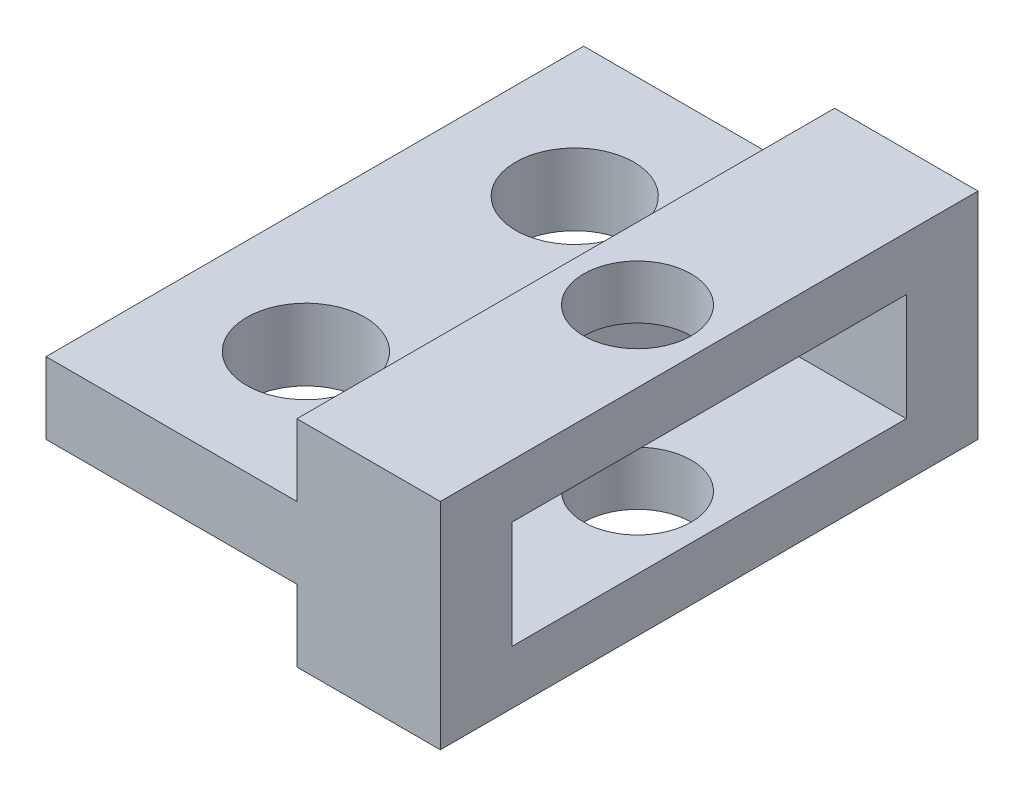
ISO-10303-21;
HEADER;
FILE_DESCRIPTION(('STEP AP214'),'2;1');
FILE_NAME('part.step','',(''),(''),'','','');
FILE_SCHEMA(('AUTOMOTIVE_DESIGN { 1 0 10303 214 1 1 1 1 }'));
ENDSEC;
DATA;
#1=APPLICATION_CONTEXT('core data for automotive mechanical design processes');
#2=APPLICATION_PROTOCOL_DEFINITION('international standard','automotive_design',2000,#1);
#3=PRODUCT_CONTEXT('',#1,'mechanical');
#4=PRODUCT('Part','Part','',(#3));
#5=PRODUCT_RELATED_PRODUCT_CATEGORY('part','',(#4));
#6=PRODUCT_DEFINITION_FORMATION('','',#4);
#7=PRODUCT_DEFINITION_CONTEXT('part definition',#1,'design');
#8=PRODUCT_DEFINITION('design','',#6,#7);
#9=PRODUCT_DEFINITION_SHAPE('','',#8);
#10=(LENGTH_UNIT() NAMED_UNIT(*) SI_UNIT(.MILLI.,.METRE.));
#11=(NAMED_UNIT(*) PLANE_ANGLE_UNIT() SI_UNIT($,.RADIAN.));
#12=(NAMED_UNIT(*) SI_UNIT($,.STERADIAN.) SOLID_ANGLE_UNIT());
#13=UNCERTAINTY_MEASURE_WITH_UNIT(LENGTH_MEASURE(1.E-05),#10,'distance_accuracy_value','');
#14=(GEOMETRIC_REPRESENTATION_CONTEXT(3) GLOBAL_UNCERTAINTY_ASSIGNED_CONTEXT((#13)) GLOBAL_UNIT_ASSIGNED_CONTEXT((#10,
#11,#12)) REPRESENTATION_CONTEXT('',''));
#15=CARTESIAN_POINT('',(0.,0.,0.));
#16=DIRECTION('',(0.,0.,1.));
#17=DIRECTION('',(1.,0.,0.));
#18=AXIS2_PLACEMENT_3D('',#15,#16,#17);
#19=CARTESIAN_POINT('',(0.,2.,0.));
#20=DIRECTION('',(-1.,0.,0.));
#21=DIRECTION('',(0.,0.,1.));
#22=AXIS2_PLACEMENT_3D('',#19,#20,#21);
#23=PLANE('',#22);
#24=DIRECTION('',(0.,-1.,0.));
#25=VECTOR('',#24,1.);
#26=CARTESIAN_POINT('',(0.,2.,0.));
#27=LINE('',#26,#25);
#28=CARTESIAN_POINT('',(0.,4.,0.));
#29=VERTEX_POINT('',#28);
#30=CARTESIAN_POINT('',(0.,-2.,0.));
#31=VERTEX_POINT('',#30);
#32=EDGE_CURVE('E216',#29,#31,#27,.T.);
#33=ORIENTED_EDGE('',*,*,#32,.T.);
#34=DIRECTION('',(0.,0.,1.));
#35=VECTOR('',#34,1.);
#36=CARTESIAN_POINT('',(0.,-2.,-15.));
#37=LINE('',#36,#35);
#38=CARTESIAN_POINT('',(0.,-2.,-15.));
#39=VERTEX_POINT('',#38);
#40=EDGE_CURVE('E171',#39,#31,#37,.T.);
#41=ORIENTED_EDGE('',*,*,#40,.F.);
#42=DIRECTION('',(0.,-1.,0.));
#43=VECTOR('',#42,1.);
#44=CARTESIAN_POINT('',(0.,2.,-15.));
#45=LINE('',#44,#43);
#46=CARTESIAN_POINT('',(0.,4.,-15.));
#47=VERTEX_POINT('',#46);
#48=EDGE_CURVE('E11',#47,#39,#45,.T.);
#49=ORIENTED_EDGE('',*,*,#48,.F.);
#50=DIRECTION('',(0.,0.,-1.));
#51=VECTOR('',#50,1.);
#52=CARTESIAN_POINT('',(0.,4.,-15.));
#53=LINE('',#52,#51);
#54=EDGE_CURVE('E190',#29,#47,#53,.T.);
#55=ORIENTED_EDGE('',*,*,#54,.F.);
#56=EDGE_LOOP('',(#33,#41,#49,#55));
#57=FACE_BOUND('',#56,.T.);
#58=DIRECTION('',(0.,1.,0.));
#59=VECTOR('',#58,1.);
#60=CARTESIAN_POINT('',(0.,0.,-2.));
#61=LINE('',#60,#59);
#62=CARTESIAN_POINT('',(0.,-0.5,-2.));
#63=VERTEX_POINT('',#62);
#64=CARTESIAN_POINT('',(0.,2.5,-2.));
#65=VERTEX_POINT('',#64);
#66=EDGE_CURVE('E49',#63,#65,#61,.T.);
#67=ORIENTED_EDGE('',*,*,#66,.T.);
#68=DIRECTION('',(0.,0.,1.));
#69=VECTOR('',#68,1.);
#70=CARTESIAN_POINT('',(0.,2.5,0.));
#71=LINE('',#70,#69);
#72=CARTESIAN_POINT('',(0.,2.5,-13.));
#73=VERTEX_POINT('',#72);
#74=EDGE_CURVE('E143',#73,#65,#71,.T.);
#75=ORIENTED_EDGE('',*,*,#74,.F.);
#76=DIRECTION('',(0.,1.,0.));
#77=VECTOR('',#76,1.);
#78=CARTESIAN_POINT('',(0.,0.,-13.));
#79=LINE('',#78,#77);
#80=CARTESIAN_POINT('',(0.,-0.5,-13.));
#81=VERTEX_POINT('',#80);
#82=EDGE_CURVE('E146',#81,#73,#79,.T.);
#83=ORIENTED_EDGE('',*,*,#82,.F.);
#84=DIRECTION('',(0.,0.,1.));
#85=VECTOR('',#84,1.);
#86=CARTESIAN_POINT('',(0.,-0.5,0.));
#87=LINE('',#86,#85);
#88=EDGE_CURVE('E155',#81,#63,#87,.T.);
#89=ORIENTED_EDGE('',*,*,#88,.T.);
#90=EDGE_LOOP('',(#67,#75,#83,#89));
#91=FACE_BOUND('',#90,.T.);
#92=ADVANCED_FACE('F33',(#57,#91),#23,.F.);
#93=CARTESIAN_POINT('',(0.,0.,0.));
#94=DIRECTION('',(0.,1.,0.));
#95=DIRECTION('',(0.,0.,1.));
#96=AXIS2_PLACEMENT_3D('',#93,#94,#95);
#97=PLANE('',#96);
#98=CARTESIAN_POINT('',(-7.5,0.,-11.25));
#99=DIRECTION('',(0.,-1.,0.));
#100=DIRECTION('',(0.,0.,-1.));
#101=AXIS2_PLACEMENT_3D('',#98,#99,#100);
#102=CIRCLE('',#101,1.65);
#103=CARTESIAN_POINT('',(-7.5,0.,-12.9));
#104=VERTEX_POINT('',#103);
#105=EDGE_CURVE('E165',#104,#104,#102,.T.);
#106=ORIENTED_EDGE('',*,*,#105,.F.);
#107=EDGE_LOOP('',(#106));
#108=FACE_BOUND('',#107,.T.);
#109=CARTESIAN_POINT('',(-7.5,0.,-3.75));
#110=DIRECTION('',(0.,-1.,0.));
#111=DIRECTION('',(0.,0.,-1.));
#112=AXIS2_PLACEMENT_3D('',#109,#110,#111);
#113=CIRCLE('',#112,1.65);
#114=CARTESIAN_POINT('',(-7.5,0.,-5.4));
#115=VERTEX_POINT('',#114);
#116=EDGE_CURVE('E161',#115,#115,#113,.T.);
#117=ORIENTED_EDGE('',*,*,#116,.F.);
#118=EDGE_LOOP('',(#117));
#119=FACE_BOUND('',#118,.T.);
#120=DIRECTION('',(0.,0.,-1.));
#121=VECTOR('',#120,1.);
#122=CARTESIAN_POINT('',(-4.,0.,-15.));
#123=LINE('',#122,#121);
#124=CARTESIAN_POINT('',(-4.,0.,0.));
#125=VERTEX_POINT('',#124);
#126=CARTESIAN_POINT('',(-4.,0.,-15.));
#127=VERTEX_POINT('',#126);
#128=EDGE_CURVE('E57',#125,#127,#123,.T.);
#129=ORIENTED_EDGE('',*,*,#128,.F.);
#130=DIRECTION('',(1.,0.,0.));
#131=VECTOR('',#130,1.);
#132=CARTESIAN_POINT('',(0.,0.,0.));
#133=LINE('',#132,#131);
#134=CARTESIAN_POINT('',(-11.,0.,0.));
#135=VERTEX_POINT('',#134);
#136=EDGE_CURVE('E212',#135,#125,#133,.T.);
#137=ORIENTED_EDGE('',*,*,#136,.F.);
#138=DIRECTION('',(0.,0.,1.));
#139=VECTOR('',#138,1.);
#140=CARTESIAN_POINT('',(-11.,0.,0.));
#141=LINE('',#140,#139);
#142=CARTESIAN_POINT('',(-11.,0.,-15.));
#143=VERTEX_POINT('',#142);
#144=EDGE_CURVE('E218',#143,#135,#141,.T.);
#145=ORIENTED_EDGE('',*,*,#144,.F.);
#146=DIRECTION('',(-1.,0.,0.));
#147=VECTOR('',#146,1.);
#148=CARTESIAN_POINT('',(0.,0.,-15.));
#149=LINE('',#148,#147);
#150=EDGE_CURVE('E208',#127,#143,#149,.T.);
#151=ORIENTED_EDGE('',*,*,#150,.F.);
#152=EDGE_LOOP('',(#129,#137,#145,#151));
#153=FACE_BOUND('',#152,.T.);
#154=ADVANCED_FACE('F274',(#108,#119,#153),#97,.F.);
#155=CARTESIAN_POINT('',(0.,2.,-15.));
#156=DIRECTION('',(0.,0.,1.));
#157=DIRECTION('',(1.,0.,0.));
#158=AXIS2_PLACEMENT_3D('',#155,#156,#157);
#159=PLANE('',#158);
#160=ORIENTED_EDGE('',*,*,#48,.T.);
#161=DIRECTION('',(1.,0.,0.));
#162=VECTOR('',#161,1.);
#163=CARTESIAN_POINT('',(0.,-2.,-15.));
#164=LINE('',#163,#162);
#165=CARTESIAN_POINT('',(-4.,-2.,-15.));
#166=VERTEX_POINT('',#165);
#167=EDGE_CURVE('E178',#166,#39,#164,.T.);
#168=ORIENTED_EDGE('',*,*,#167,.F.);
#169=DIRECTION('',(0.,1.,0.));
#170=VECTOR('',#169,1.);
#171=CARTESIAN_POINT('',(-4.,-2.,-15.));
#172=LINE('',#171,#170);
#173=EDGE_CURVE('E181',#166,#127,#172,.T.);
#174=ORIENTED_EDGE('',*,*,#173,.T.);
#175=ORIENTED_EDGE('',*,*,#150,.T.);
#176=DIRECTION('',(0.,-1.,0.));
#177=VECTOR('',#176,1.);
#178=CARTESIAN_POINT('',(-11.,2.,-15.));
#179=LINE('',#178,#177);
#180=CARTESIAN_POINT('',(-11.,2.,-15.));
#181=VERTEX_POINT('',#180);
#182=EDGE_CURVE('E41',#181,#143,#179,.T.);
#183=ORIENTED_EDGE('',*,*,#182,.F.);
#184=DIRECTION('',(-1.,0.,0.));
#185=VECTOR('',#184,1.);
#186=CARTESIAN_POINT('',(0.,2.,-15.));
#187=LINE('',#186,#185);
#188=CARTESIAN_POINT('',(-4.,2.,-15.));
#189=VERTEX_POINT('',#188);
#190=EDGE_CURVE('E209',#189,#181,#187,.T.);
#191=ORIENTED_EDGE('',*,*,#190,.F.);
#192=DIRECTION('',(0.,-1.,0.));
#193=VECTOR('',#192,1.);
#194=CARTESIAN_POINT('',(-4.,4.,-15.));
#195=LINE('',#194,#193);
#196=CARTESIAN_POINT('',(-4.,4.,-15.));
#197=VERTEX_POINT('',#196);
#198=EDGE_CURVE('E205',#197,#189,#195,.T.);
#199=ORIENTED_EDGE('',*,*,#198,.F.);
#200=DIRECTION('',(-1.,0.,0.));
#201=VECTOR('',#200,1.);
#202=CARTESIAN_POINT('',(0.,4.,-15.));
#203=LINE('',#202,#201);
#204=EDGE_CURVE('E193',#47,#197,#203,.T.);
#205=ORIENTED_EDGE('',*,*,#204,.F.);
#206=EDGE_LOOP('',(#160,#168,#174,#175,#183,#191,#199,#205));
#207=FACE_BOUND('',#206,.T.);
#208=ADVANCED_FACE('F249',(#207),#159,.F.);
#209=CARTESIAN_POINT('',(-11.,2.,0.));
#210=DIRECTION('',(1.,0.,0.));
#211=DIRECTION('',(0.,0.,-1.));
#212=AXIS2_PLACEMENT_3D('',#209,#210,#211);
#213=PLANE('',#212);
#214=ORIENTED_EDGE('',*,*,#144,.T.);
#215=DIRECTION('',(0.,-1.,0.));
#216=VECTOR('',#215,1.);
#217=CARTESIAN_POINT('',(-11.,2.,0.));
#218=LINE('',#217,#216);
#219=CARTESIAN_POINT('',(-11.,2.,0.));
#220=VERTEX_POINT('',#219);
#221=EDGE_CURVE('E222',#220,#135,#218,.T.);
#222=ORIENTED_EDGE('',*,*,#221,.F.);
#223=DIRECTION('',(0.,0.,1.));
#224=VECTOR('',#223,1.);
#225=CARTESIAN_POINT('',(-11.,2.,0.));
#226=LINE('',#225,#224);
#227=EDGE_CURVE('E211',#181,#220,#226,.T.);
#228=ORIENTED_EDGE('',*,*,#227,.F.);
#229=ORIENTED_EDGE('',*,*,#182,.T.);
#230=EDGE_LOOP('',(#214,#222,#228,#229));
#231=FACE_BOUND('',#230,.T.);
#232=ADVANCED_FACE('F272',(#231),#213,.F.);
#233=CARTESIAN_POINT('',(0.,2.,0.));
#234=DIRECTION('',(0.,0.,-1.));
#235=DIRECTION('',(-1.,0.,0.));
#236=AXIS2_PLACEMENT_3D('',#233,#234,#235);
#237=PLANE('',#236);
#238=ORIENTED_EDGE('',*,*,#136,.T.);
#239=DIRECTION('',(0.,1.,0.));
#240=VECTOR('',#239,1.);
#241=CARTESIAN_POINT('',(-4.,-2.,0.));
#242=LINE('',#241,#240);
#243=CARTESIAN_POINT('',(-4.,-2.,0.));
#244=VERTEX_POINT('',#243);
#245=EDGE_CURVE('E186',#244,#125,#242,.T.);
#246=ORIENTED_EDGE('',*,*,#245,.F.);
#247=DIRECTION('',(-1.,0.,0.));
#248=VECTOR('',#247,1.);
#249=CARTESIAN_POINT('',(0.,-2.,0.));
#250=LINE('',#249,#248);
#251=EDGE_CURVE('E174',#31,#244,#250,.T.);
#252=ORIENTED_EDGE('',*,*,#251,.F.);
#253=ORIENTED_EDGE('',*,*,#32,.F.);
#254=DIRECTION('',(1.,0.,0.));
#255=VECTOR('',#254,1.);
#256=CARTESIAN_POINT('',(0.,4.,0.));
#257=LINE('',#256,#255);
#258=CARTESIAN_POINT('',(-4.,4.,0.));
#259=VERTEX_POINT('',#258);
#260=EDGE_CURVE('E197',#259,#29,#257,.T.);
#261=ORIENTED_EDGE('',*,*,#260,.F.);
#262=DIRECTION('',(0.,-1.,0.));
#263=VECTOR('',#262,1.);
#264=CARTESIAN_POINT('',(-4.,4.,0.));
#265=LINE('',#264,#263);
#266=CARTESIAN_POINT('',(-4.,2.,0.));
#267=VERTEX_POINT('',#266);
#268=EDGE_CURVE('E200',#259,#267,#265,.T.);
#269=ORIENTED_EDGE('',*,*,#268,.T.);
#270=DIRECTION('',(1.,0.,0.));
#271=VECTOR('',#270,1.);
#272=CARTESIAN_POINT('',(0.,2.,0.));
#273=LINE('',#272,#271);
#274=EDGE_CURVE('E214',#220,#267,#273,.T.);
#275=ORIENTED_EDGE('',*,*,#274,.F.);
#276=ORIENTED_EDGE('',*,*,#221,.T.);
#277=EDGE_LOOP('',(#238,#246,#252,#253,#261,#269,#275,#276));
#278=FACE_BOUND('',#277,.T.);
#279=ADVANCED_FACE('F238',(#278),#237,.F.);
#280=CARTESIAN_POINT('',(0.,2.,0.));
#281=DIRECTION('',(0.,1.,0.));
#282=DIRECTION('',(0.,0.,1.));
#283=AXIS2_PLACEMENT_3D('',#280,#281,#282);
#284=PLANE('',#283);
#285=CARTESIAN_POINT('',(-7.5,2.,-11.25));
#286=DIRECTION('',(0.,1.,0.));
#287=DIRECTION('',(0.,0.,1.));
#288=AXIS2_PLACEMENT_3D('',#285,#286,#287);
#289=CIRCLE('',#288,1.65);
#290=CARTESIAN_POINT('',(-7.5,2.,-12.9));
#291=VERTEX_POINT('',#290);
#292=EDGE_CURVE('E183',#291,#291,#289,.T.);
#293=ORIENTED_EDGE('',*,*,#292,.F.);
#294=EDGE_LOOP('',(#293));
#295=FACE_BOUND('',#294,.T.);
#296=CARTESIAN_POINT('',(-7.5,2.,-3.75));
#297=DIRECTION('',(0.,1.,0.));
#298=DIRECTION('',(0.,0.,1.));
#299=AXIS2_PLACEMENT_3D('',#296,#297,#298);
#300=CIRCLE('',#299,1.65);
#301=CARTESIAN_POINT('',(-7.5,2.,-5.4));
#302=VERTEX_POINT('',#301);
#303=EDGE_CURVE('E168',#302,#302,#300,.T.);
#304=ORIENTED_EDGE('',*,*,#303,.F.);
#305=EDGE_LOOP('',(#304));
#306=FACE_BOUND('',#305,.T.);
#307=DIRECTION('',(0.,0.,1.));
#308=VECTOR('',#307,1.);
#309=CARTESIAN_POINT('',(-4.,2.,-15.));
#310=LINE('',#309,#308);
#311=EDGE_CURVE('E189',#189,#267,#310,.T.);
#312=ORIENTED_EDGE('',*,*,#311,.F.);
#313=ORIENTED_EDGE('',*,*,#190,.T.);
#314=ORIENTED_EDGE('',*,*,#227,.T.);
#315=ORIENTED_EDGE('',*,*,#274,.T.);
#316=EDGE_LOOP('',(#312,#313,#314,#315));
#317=FACE_BOUND('',#316,.T.);
#318=ADVANCED_FACE('F234',(#295,#306,#317),#284,.T.);
#319=CARTESIAN_POINT('',(-4.,4.,-15.));
#320=DIRECTION('',(1.,0.,0.));
#321=DIRECTION('',(0.,0.,-1.));
#322=AXIS2_PLACEMENT_3D('',#319,#320,#321);
#323=PLANE('',#322);
#324=ORIENTED_EDGE('',*,*,#311,.T.);
#325=ORIENTED_EDGE('',*,*,#268,.F.);
#326=DIRECTION('',(0.,0.,1.));
#327=VECTOR('',#326,1.);
#328=CARTESIAN_POINT('',(-4.,4.,-15.));
#329=LINE('',#328,#327);
#330=EDGE_CURVE('E195',#197,#259,#329,.T.);
#331=ORIENTED_EDGE('',*,*,#330,.F.);
#332=ORIENTED_EDGE('',*,*,#198,.T.);
#333=EDGE_LOOP('',(#324,#325,#331,#332));
#334=FACE_BOUND('',#333,.T.);
#335=ADVANCED_FACE('F237',(#334),#323,.F.);
#336=CARTESIAN_POINT('',(0.,4.,0.));
#337=DIRECTION('',(0.,-1.,0.));
#338=DIRECTION('',(0.,0.,-1.));
#339=AXIS2_PLACEMENT_3D('',#336,#337,#338);
#340=PLANE('',#339);
#341=CARTESIAN_POINT('',(-2.,4.,-7.5));
#342=DIRECTION('',(0.,-1.,0.));
#343=DIRECTION('',(0.,0.,-1.));
#344=AXIS2_PLACEMENT_3D('',#341,#342,#343);
#345=CIRCLE('',#344,1.5);
#346=CARTESIAN_POINT('',(-2.,4.,-9.));
#347=VERTEX_POINT('',#346);
#348=EDGE_CURVE('E149',#347,#347,#345,.T.);
#349=ORIENTED_EDGE('',*,*,#348,.T.);
#350=EDGE_LOOP('',(#349));
#351=FACE_BOUND('',#350,.T.);
#352=ORIENTED_EDGE('',*,*,#54,.T.);
#353=ORIENTED_EDGE('',*,*,#204,.T.);
#354=ORIENTED_EDGE('',*,*,#330,.T.);
#355=ORIENTED_EDGE('',*,*,#260,.T.);
#356=EDGE_LOOP('',(#352,#353,#354,#355));
#357=FACE_BOUND('',#356,.T.);
#358=ADVANCED_FACE('F255',(#351,#357),#340,.F.);
#359=CARTESIAN_POINT('',(-4.,-2.,-15.));
#360=DIRECTION('',(1.,0.,0.));
#361=DIRECTION('',(0.,0.,-1.));
#362=AXIS2_PLACEMENT_3D('',#359,#360,#361);
#363=PLANE('',#362);
#364=ORIENTED_EDGE('',*,*,#128,.T.);
#365=ORIENTED_EDGE('',*,*,#173,.F.);
#366=DIRECTION('',(0.,0.,-1.));
#367=VECTOR('',#366,1.);
#368=CARTESIAN_POINT('',(-4.,-2.,-15.));
#369=LINE('',#368,#367);
#370=EDGE_CURVE('E176',#244,#166,#369,.T.);
#371=ORIENTED_EDGE('',*,*,#370,.F.);
#372=ORIENTED_EDGE('',*,*,#245,.T.);
#373=EDGE_LOOP('',(#364,#365,#371,#372));
#374=FACE_BOUND('',#373,.T.);
#375=ADVANCED_FACE('F269',(#374),#363,.F.);
#376=CARTESIAN_POINT('',(0.,-2.,0.));
#377=DIRECTION('',(0.,-1.,0.));
#378=DIRECTION('',(0.,0.,-1.));
#379=AXIS2_PLACEMENT_3D('',#376,#377,#378);
#380=PLANE('',#379);
#381=CARTESIAN_POINT('',(-2.,-2.,-7.5));
#382=DIRECTION('',(0.,-1.,0.));
#383=DIRECTION('',(0.,0.,-1.));
#384=AXIS2_PLACEMENT_3D('',#381,#382,#383);
#385=CIRCLE('',#384,1.5);
#386=CARTESIAN_POINT('',(-2.,-2.,-9.));
#387=VERTEX_POINT('',#386);
#388=EDGE_CURVE('E463',#387,#387,#385,.T.);
#389=ORIENTED_EDGE('',*,*,#388,.F.);
#390=EDGE_LOOP('',(#389));
#391=FACE_BOUND('',#390,.T.);
#392=ORIENTED_EDGE('',*,*,#40,.T.);
#393=ORIENTED_EDGE('',*,*,#251,.T.);
#394=ORIENTED_EDGE('',*,*,#370,.T.);
#395=ORIENTED_EDGE('',*,*,#167,.T.);
#396=EDGE_LOOP('',(#392,#393,#394,#395));
#397=FACE_BOUND('',#396,.T.);
#398=ADVANCED_FACE('F261',(#391,#397),#380,.T.);
#399=CARTESIAN_POINT('',(-7.5,13.,-3.75));
#400=DIRECTION('',(0.,-1.,0.));
#401=DIRECTION('',(0.,0.,-1.));
#402=AXIS2_PLACEMENT_3D('',#399,#400,#401);
#403=CYLINDRICAL_SURFACE('',#402,1.65);
#404=CARTESIAN_POINT('',(-7.5,2.,-5.4));
#405=CARTESIAN_POINT('',(-7.5,1.97916666666667,-5.4));
#406=CARTESIAN_POINT('',(-7.5,1.95833333333333,-5.4));
#407=CARTESIAN_POINT('',(-7.5,1.91666666666667,-5.4));
#408=CARTESIAN_POINT('',(-7.5,1.89583333333333,-5.4));
#409=CARTESIAN_POINT('',(-7.5,1.85416666666667,-5.4));
#410=CARTESIAN_POINT('',(-7.5,1.83333333333333,-5.4));
#411=CARTESIAN_POINT('',(-7.5,1.79166666666667,-5.4));
#412=CARTESIAN_POINT('',(-7.5,1.77083333333333,-5.4));
#413=CARTESIAN_POINT('',(-7.5,1.72916666666667,-5.4));
#414=CARTESIAN_POINT('',(-7.5,1.70833333333333,-5.4));
#415=CARTESIAN_POINT('',(-7.5,1.66666666666667,-5.4));
#416=CARTESIAN_POINT('',(-7.5,1.64583333333333,-5.4));
#417=CARTESIAN_POINT('',(-7.5,1.60416666666667,-5.4));
#418=CARTESIAN_POINT('',(-7.5,1.58333333333333,-5.4));
#419=CARTESIAN_POINT('',(-7.5,1.54166666666667,-5.4));
#420=CARTESIAN_POINT('',(-7.5,1.52083333333333,-5.4));
#421=CARTESIAN_POINT('',(-7.5,1.47916666666667,-5.4));
#422=CARTESIAN_POINT('',(-7.5,1.45833333333333,-5.4));
#423=CARTESIAN_POINT('',(-7.5,1.41666666666667,-5.4));
#424=CARTESIAN_POINT('',(-7.5,1.39583333333333,-5.4));
#425=CARTESIAN_POINT('',(-7.5,1.35416666666667,-5.4));
#426=CARTESIAN_POINT('',(-7.5,1.33333333333333,-5.4));
#427=CARTESIAN_POINT('',(-7.5,1.29166666666667,-5.4));
#428=CARTESIAN_POINT('',(-7.5,1.27083333333333,-5.4));
#429=CARTESIAN_POINT('',(-7.5,1.22916666666667,-5.4));
#430=CARTESIAN_POINT('',(-7.5,1.20833333333333,-5.4));
#431=CARTESIAN_POINT('',(-7.5,1.16666666666667,-5.4));
#432=CARTESIAN_POINT('',(-7.5,1.14583333333333,-5.4));
#433=CARTESIAN_POINT('',(-7.5,1.10416666666667,-5.4));
#434=CARTESIAN_POINT('',(-7.5,1.08333333333333,-5.4));
#435=CARTESIAN_POINT('',(-7.5,1.04166666666667,-5.4));
#436=CARTESIAN_POINT('',(-7.5,1.02083333333333,-5.4));
#437=CARTESIAN_POINT('',(-7.5,0.979166666666668,-5.4));
#438=CARTESIAN_POINT('',(-7.5,0.958333333333334,-5.4));
#439=CARTESIAN_POINT('',(-7.5,0.916666666666668,-5.4));
#440=CARTESIAN_POINT('',(-7.5,0.895833333333334,-5.4));
#441=CARTESIAN_POINT('',(-7.5,0.854166666666667,-5.4));
#442=CARTESIAN_POINT('',(-7.5,0.833333333333334,-5.4));
#443=CARTESIAN_POINT('',(-7.5,0.791666666666667,-5.4));
#444=CARTESIAN_POINT('',(-7.5,0.770833333333334,-5.4));
#445=CARTESIAN_POINT('',(-7.5,0.729166666666667,-5.4));
#446=CARTESIAN_POINT('',(-7.5,0.708333333333334,-5.4));
#447=CARTESIAN_POINT('',(-7.5,0.666666666666667,-5.4));
#448=CARTESIAN_POINT('',(-7.5,0.645833333333334,-5.4));
#449=CARTESIAN_POINT('',(-7.5,0.604166666666668,-5.4));
#450=CARTESIAN_POINT('',(-7.5,0.583333333333335,-5.4));
#451=CARTESIAN_POINT('',(-7.5,0.541666666666669,-5.4));
#452=CARTESIAN_POINT('',(-7.5,0.520833333333335,-5.4));
#453=CARTESIAN_POINT('',(-7.5,0.479166666666669,-5.4));
#454=CARTESIAN_POINT('',(-7.5,0.458333333333335,-5.4));
#455=CARTESIAN_POINT('',(-7.5,0.416666666666669,-5.4));
#456=CARTESIAN_POINT('',(-7.5,0.395833333333335,-5.4));
#457=CARTESIAN_POINT('',(-7.5,0.354166666666669,-5.4));
#458=CARTESIAN_POINT('',(-7.5,0.333333333333335,-5.4));
#459=CARTESIAN_POINT('',(-7.5,0.291666666666669,-5.4));
#460=CARTESIAN_POINT('',(-7.5,0.270833333333335,-5.4));
#461=CARTESIAN_POINT('',(-7.5,0.229166666666669,-5.4));
#462=CARTESIAN_POINT('',(-7.5,0.208333333333335,-5.4));
#463=CARTESIAN_POINT('',(-7.5,0.166666666666669,-5.4));
#464=CARTESIAN_POINT('',(-7.5,0.145833333333335,-5.4));
#465=CARTESIAN_POINT('',(-7.5,0.104166666666669,-5.4));
#466=CARTESIAN_POINT('',(-7.5,0.0833333333333351,-5.4));
#467=CARTESIAN_POINT('',(-7.5,0.0416666666666684,-5.4));
#468=CARTESIAN_POINT('',(-7.5,0.0208333333333351,-5.4));
#469=CARTESIAN_POINT('',(-7.5,0.,-5.4));
#470=B_SPLINE_CURVE_WITH_KNOTS('',3,(#404,#405,#406,#407,#408,#409,#410,#411,#412,#413,#414,
#415,#416,#417,#418,#419,#420,#421,#422,#423,#424,#425,#426,#427,#428,#429,#430,#431,#432,#433,
#434,#435,#436,#437,#438,#439,#440,#441,#442,#443,#444,#445,#446,#447,#448,#449,#450,#451,#452,
#453,#454,#455,#456,#457,#458,#459,#460,#461,#462,#463,#464,#465,#466,#467,#468,#469),
.UNSPECIFIED.,.F.,.F.,(4,2,2,2,2,2,2,2,2,2,2,2,2,2,2,2,2,2,2,2,2,2,2,2,2,2,2,2,2,2,2,2,4),(0.,
0.0625000000000001,0.125,0.1875,0.25,0.3125,0.375,0.4375,0.5,0.562499999999999,
0.624999999999999,0.687499999999999,0.749999999999999,0.812499999999999,0.874999999999999,
0.937499999999999,0.999999999999999,1.0625,1.125,1.1875,1.25,1.3125,1.375,1.4375,1.5,1.5625,
1.625,1.6875,1.75,1.8125,1.875,1.9375,2.),.UNSPECIFIED.);
#471=EDGE_CURVE('BSEAM327',#302,#115,#470,.T.);
#472=ORIENTED_EDGE('',*,*,#303,.T.);
#473=ORIENTED_EDGE('',*,*,#116,.T.);
#474=ORIENTED_EDGE('',*,*,#471,.T.);
#475=ORIENTED_EDGE('',*,*,#471,.F.);
#476=EDGE_LOOP('',(#472,#474,#473,#475));
#477=FACE_BOUND('',#476,.T.);
#478=ADVANCED_FACE('F327',(#477),#403,.F.);
#479=CARTESIAN_POINT('',(-7.5,13.,-11.25));
#480=DIRECTION('',(0.,-1.,0.));
#481=DIRECTION('',(0.,0.,-1.));
#482=AXIS2_PLACEMENT_3D('',#479,#480,#481);
#483=CYLINDRICAL_SURFACE('',#482,1.65);
#484=CARTESIAN_POINT('',(-7.5,2.,-12.9));
#485=CARTESIAN_POINT('',(-7.5,1.97916666666667,-12.9));
#486=CARTESIAN_POINT('',(-7.5,1.95833333333333,-12.9));
#487=CARTESIAN_POINT('',(-7.5,1.91666666666667,-12.9));
#488=CARTESIAN_POINT('',(-7.5,1.89583333333333,-12.9));
#489=CARTESIAN_POINT('',(-7.5,1.85416666666667,-12.9));
#490=CARTESIAN_POINT('',(-7.5,1.83333333333333,-12.9));
#491=CARTESIAN_POINT('',(-7.5,1.79166666666667,-12.9));
#492=CARTESIAN_POINT('',(-7.5,1.77083333333333,-12.9));
#493=CARTESIAN_POINT('',(-7.5,1.72916666666667,-12.9));
#494=CARTESIAN_POINT('',(-7.5,1.70833333333333,-12.9));
#495=CARTESIAN_POINT('',(-7.5,1.66666666666667,-12.9));
#496=CARTESIAN_POINT('',(-7.5,1.64583333333333,-12.9));
#497=CARTESIAN_POINT('',(-7.5,1.60416666666667,-12.9));
#498=CARTESIAN_POINT('',(-7.5,1.58333333333333,-12.9));
#499=CARTESIAN_POINT('',(-7.5,1.54166666666667,-12.9));
#500=CARTESIAN_POINT('',(-7.5,1.52083333333333,-12.9));
#501=CARTESIAN_POINT('',(-7.5,1.47916666666667,-12.9));
#502=CARTESIAN_POINT('',(-7.5,1.45833333333333,-12.9));
#503=CARTESIAN_POINT('',(-7.5,1.41666666666667,-12.9));
#504=CARTESIAN_POINT('',(-7.5,1.39583333333333,-12.9));
#505=CARTESIAN_POINT('',(-7.5,1.35416666666667,-12.9));
#506=CARTESIAN_POINT('',(-7.5,1.33333333333333,-12.9));
#507=CARTESIAN_POINT('',(-7.5,1.29166666666667,-12.9));
#508=CARTESIAN_POINT('',(-7.5,1.27083333333333,-12.9));
#509=CARTESIAN_POINT('',(-7.5,1.22916666666667,-12.9));
#510=CARTESIAN_POINT('',(-7.5,1.20833333333333,-12.9));
#511=CARTESIAN_POINT('',(-7.5,1.16666666666667,-12.9));
#512=CARTESIAN_POINT('',(-7.5,1.14583333333333,-12.9));
#513=CARTESIAN_POINT('',(-7.5,1.10416666666667,-12.9));
#514=CARTESIAN_POINT('',(-7.5,1.08333333333333,-12.9));
#515=CARTESIAN_POINT('',(-7.5,1.04166666666667,-12.9));
#516=CARTESIAN_POINT('',(-7.5,1.02083333333333,-12.9));
#517=CARTESIAN_POINT('',(-7.5,0.979166666666668,-12.9));
#518=CARTESIAN_POINT('',(-7.5,0.958333333333334,-12.9));
#519=CARTESIAN_POINT('',(-7.5,0.916666666666668,-12.9));
#520=CARTESIAN_POINT('',(-7.5,0.895833333333334,-12.9));
#521=CARTESIAN_POINT('',(-7.5,0.854166666666667,-12.9));
#522=CARTESIAN_POINT('',(-7.5,0.833333333333334,-12.9));
#523=CARTESIAN_POINT('',(-7.5,0.791666666666667,-12.9));
#524=CARTESIAN_POINT('',(-7.5,0.770833333333334,-12.9));
#525=CARTESIAN_POINT('',(-7.5,0.729166666666667,-12.9));
#526=CARTESIAN_POINT('',(-7.5,0.708333333333334,-12.9));
#527=CARTESIAN_POINT('',(-7.5,0.666666666666667,-12.9));
#528=CARTESIAN_POINT('',(-7.5,0.645833333333334,-12.9));
#529=CARTESIAN_POINT('',(-7.5,0.604166666666668,-12.9));
#530=CARTESIAN_POINT('',(-7.5,0.583333333333335,-12.9));
#531=CARTESIAN_POINT('',(-7.5,0.541666666666669,-12.9));
#532=CARTESIAN_POINT('',(-7.5,0.520833333333335,-12.9));
#533=CARTESIAN_POINT('',(-7.5,0.479166666666669,-12.9));
#534=CARTESIAN_POINT('',(-7.5,0.458333333333335,-12.9));
#535=CARTESIAN_POINT('',(-7.5,0.416666666666669,-12.9));
#536=CARTESIAN_POINT('',(-7.5,0.395833333333335,-12.9));
#537=CARTESIAN_POINT('',(-7.5,0.354166666666669,-12.9));
#538=CARTESIAN_POINT('',(-7.5,0.333333333333335,-12.9));
#539=CARTESIAN_POINT('',(-7.5,0.291666666666669,-12.9));
#540=CARTESIAN_POINT('',(-7.5,0.270833333333335,-12.9));
#541=CARTESIAN_POINT('',(-7.5,0.229166666666669,-12.9));
#542=CARTESIAN_POINT('',(-7.5,0.208333333333335,-12.9));
#543=CARTESIAN_POINT('',(-7.5,0.166666666666669,-12.9));
#544=CARTESIAN_POINT('',(-7.5,0.145833333333335,-12.9));
#545=CARTESIAN_POINT('',(-7.5,0.104166666666669,-12.9));
#546=CARTESIAN_POINT('',(-7.5,0.0833333333333351,-12.9));
#547=CARTESIAN_POINT('',(-7.5,0.0416666666666684,-12.9));
#548=CARTESIAN_POINT('',(-7.5,0.0208333333333351,-12.9));
#549=CARTESIAN_POINT('',(-7.5,0.,-12.9));
#550=B_SPLINE_CURVE_WITH_KNOTS('',3,(#484,#485,#486,#487,#488,#489,#490,#491,#492,#493,#494,
#495,#496,#497,#498,#499,#500,#501,#502,#503,#504,#505,#506,#507,#508,#509,#510,#511,#512,#513,
#514,#515,#516,#517,#518,#519,#520,#521,#522,#523,#524,#525,#526,#527,#528,#529,#530,#531,#532,
#533,#534,#535,#536,#537,#538,#539,#540,#541,#542,#543,#544,#545,#546,#547,#548,#549),
.UNSPECIFIED.,.F.,.F.,(4,2,2,2,2,2,2,2,2,2,2,2,2,2,2,2,2,2,2,2,2,2,2,2,2,2,2,2,2,2,2,2,4),(0.,
0.0625000000000001,0.125,0.1875,0.25,0.3125,0.375,0.4375,0.5,0.562499999999999,
0.624999999999999,0.687499999999999,0.749999999999999,0.812499999999999,0.874999999999999,
0.937499999999999,0.999999999999999,1.0625,1.125,1.1875,1.25,1.3125,1.375,1.4375,1.5,1.5625,
1.625,1.6875,1.75,1.8125,1.875,1.9375,2.),.UNSPECIFIED.);
#551=EDGE_CURVE('BSEAM231',#291,#104,#550,.T.);
#552=ORIENTED_EDGE('',*,*,#292,.T.);
#553=ORIENTED_EDGE('',*,*,#105,.T.);
#554=ORIENTED_EDGE('',*,*,#551,.T.);
#555=ORIENTED_EDGE('',*,*,#551,.F.);
#556=EDGE_LOOP('',(#552,#554,#553,#555));
#557=FACE_BOUND('',#556,.T.);
#558=ADVANCED_FACE('F231',(#557),#483,.F.);
#559=CARTESIAN_POINT('',(-3.8,0.,-2.));
#560=DIRECTION('',(0.,0.,-1.));
#561=DIRECTION('',(-1.,0.,0.));
#562=AXIS2_PLACEMENT_3D('',#559,#560,#561);
#563=PLANE('',#562);
#564=ORIENTED_EDGE('',*,*,#66,.F.);
#565=DIRECTION('',(1.,0.,0.));
#566=VECTOR('',#565,1.);
#567=CARTESIAN_POINT('',(-3.8,-0.5,-2.));
#568=LINE('',#567,#566);
#569=CARTESIAN_POINT('',(-3.8,-0.5,-2.));
#570=VERTEX_POINT('',#569);
#571=EDGE_CURVE('E126',#570,#63,#568,.T.);
#572=ORIENTED_EDGE('',*,*,#571,.F.);
#573=DIRECTION('',(0.,1.,0.));
#574=VECTOR('',#573,1.);
#575=CARTESIAN_POINT('',(-3.8,0.,-2.));
#576=LINE('',#575,#574);
#577=CARTESIAN_POINT('',(-3.8,2.5,-2.));
#578=VERTEX_POINT('',#577);
#579=EDGE_CURVE('E134',#570,#578,#576,.T.);
#580=ORIENTED_EDGE('',*,*,#579,.T.);
#581=DIRECTION('',(1.,0.,0.));
#582=VECTOR('',#581,1.);
#583=CARTESIAN_POINT('',(-3.8,2.5,-2.));
#584=LINE('',#583,#582);
#585=EDGE_CURVE('E159',#578,#65,#584,.T.);
#586=ORIENTED_EDGE('',*,*,#585,.T.);
#587=EDGE_LOOP('',(#564,#572,#580,#586));
#588=FACE_BOUND('',#587,.T.);
#589=ADVANCED_FACE('F136',(#588),#563,.T.);
#590=CARTESIAN_POINT('',(-3.8,2.5,0.));
#591=DIRECTION('',(0.,1.,0.));
#592=DIRECTION('',(0.,0.,1.));
#593=AXIS2_PLACEMENT_3D('',#590,#591,#592);
#594=PLANE('',#593);
#595=CARTESIAN_POINT('',(-2.,2.5,-7.5));
#596=DIRECTION('',(0.,1.,0.));
#597=DIRECTION('',(0.,0.,1.));
#598=AXIS2_PLACEMENT_3D('',#595,#596,#597);
#599=CIRCLE('',#598,1.5);
#600=CARTESIAN_POINT('',(-2.,2.5,-6.));
#601=VERTEX_POINT('',#600);
#602=EDGE_CURVE('E459',#601,#601,#599,.T.);
#603=ORIENTED_EDGE('',*,*,#602,.T.);
#604=EDGE_LOOP('',(#603));
#605=FACE_BOUND('',#604,.T.);
#606=ORIENTED_EDGE('',*,*,#74,.T.);
#607=ORIENTED_EDGE('',*,*,#585,.F.);
#608=DIRECTION('',(0.,0.,1.));
#609=VECTOR('',#608,1.);
#610=CARTESIAN_POINT('',(-3.8,2.5,0.));
#611=LINE('',#610,#609);
#612=CARTESIAN_POINT('',(-3.8,2.5,-13.));
#613=VERTEX_POINT('',#612);
#614=EDGE_CURVE('E138',#613,#578,#611,.T.);
#615=ORIENTED_EDGE('',*,*,#614,.F.);
#616=DIRECTION('',(1.,0.,0.));
#617=VECTOR('',#616,1.);
#618=CARTESIAN_POINT('',(-3.8,2.5,-13.));
#619=LINE('',#618,#617);
#620=EDGE_CURVE('E162',#613,#73,#619,.T.);
#621=ORIENTED_EDGE('',*,*,#620,.T.);
#622=EDGE_LOOP('',(#606,#607,#615,#621));
#623=FACE_BOUND('',#622,.T.);
#624=ADVANCED_FACE('F349',(#605,#623),#594,.F.);
#625=CARTESIAN_POINT('',(-3.8,0.,-13.));
#626=DIRECTION('',(0.,0.,-1.));
#627=DIRECTION('',(-1.,0.,0.));
#628=AXIS2_PLACEMENT_3D('',#625,#626,#627);
#629=PLANE('',#628);
#630=ORIENTED_EDGE('',*,*,#82,.T.);
#631=ORIENTED_EDGE('',*,*,#620,.F.);
#632=DIRECTION('',(0.,1.,0.));
#633=VECTOR('',#632,1.);
#634=CARTESIAN_POINT('',(-3.8,0.,-13.));
#635=LINE('',#634,#633);
#636=CARTESIAN_POINT('',(-3.8,-0.5,-13.));
#637=VERTEX_POINT('',#636);
#638=EDGE_CURVE('E133',#637,#613,#635,.T.);
#639=ORIENTED_EDGE('',*,*,#638,.F.);
#640=DIRECTION('',(1.,0.,0.));
#641=VECTOR('',#640,1.);
#642=CARTESIAN_POINT('',(-3.8,-0.5,-13.));
#643=LINE('',#642,#641);
#644=EDGE_CURVE('E128',#637,#81,#643,.T.);
#645=ORIENTED_EDGE('',*,*,#644,.T.);
#646=EDGE_LOOP('',(#630,#631,#639,#645));
#647=FACE_BOUND('',#646,.T.);
#648=ADVANCED_FACE('F356',(#647),#629,.F.);
#649=CARTESIAN_POINT('',(-3.8,-0.5,0.));
#650=DIRECTION('',(0.,1.,0.));
#651=DIRECTION('',(0.,0.,1.));
#652=AXIS2_PLACEMENT_3D('',#649,#650,#651);
#653=PLANE('',#652);
#654=CARTESIAN_POINT('',(-2.,-0.5,-7.5));
#655=DIRECTION('',(0.,1.,0.));
#656=DIRECTION('',(0.,0.,1.));
#657=AXIS2_PLACEMENT_3D('',#654,#655,#656);
#658=CIRCLE('',#657,1.5);
#659=CARTESIAN_POINT('',(-2.,-0.5,-6.));
#660=VERTEX_POINT('',#659);
#661=EDGE_CURVE('E36',#660,#660,#658,.T.);
#662=ORIENTED_EDGE('',*,*,#661,.F.);
#663=EDGE_LOOP('',(#662));
#664=FACE_BOUND('',#663,.T.);
#665=ORIENTED_EDGE('',*,*,#88,.F.);
#666=ORIENTED_EDGE('',*,*,#644,.F.);
#667=DIRECTION('',(0.,0.,1.));
#668=VECTOR('',#667,1.);
#669=CARTESIAN_POINT('',(-3.8,-0.5,0.));
#670=LINE('',#669,#668);
#671=EDGE_CURVE('E123',#637,#570,#670,.T.);
#672=ORIENTED_EDGE('',*,*,#671,.T.);
#673=ORIENTED_EDGE('',*,*,#571,.T.);
#674=EDGE_LOOP('',(#665,#666,#672,#673));
#675=FACE_BOUND('',#674,.T.);
#676=ADVANCED_FACE('F125',(#664,#675),#653,.T.);
#677=CARTESIAN_POINT('',(-3.8,0.,0.));
#678=DIRECTION('',(1.,0.,0.));
#679=DIRECTION('',(0.,0.,-1.));
#680=AXIS2_PLACEMENT_3D('',#677,#678,#679);
#681=PLANE('',#680);
#682=ORIENTED_EDGE('',*,*,#579,.F.);
#683=ORIENTED_EDGE('',*,*,#671,.F.);
#684=ORIENTED_EDGE('',*,*,#638,.T.);
#685=ORIENTED_EDGE('',*,*,#614,.T.);
#686=EDGE_LOOP('',(#682,#683,#684,#685));
#687=FACE_BOUND('',#686,.T.);
#688=ADVANCED_FACE('F141',(#687),#681,.T.);
#689=CARTESIAN_POINT('',(-2.,15.8,-7.5));
#690=DIRECTION('',(0.,-1.,0.));
#691=DIRECTION('',(0.,0.,-1.));
#692=AXIS2_PLACEMENT_3D('',#689,#690,#691);
#693=CYLINDRICAL_SURFACE('',#692,1.5);
#694=ORIENTED_EDGE('',*,*,#661,.T.);
#695=EDGE_LOOP('',(#694));
#696=FACE_BOUND('',#695,.T.);
#697=ORIENTED_EDGE('',*,*,#388,.T.);
#698=EDGE_LOOP('',(#697));
#699=FACE_BOUND('',#698,.T.);
#700=ADVANCED_FACE('F377',(#696,#699),#693,.F.);
#701=ORIENTED_EDGE('',*,*,#602,.F.);
#702=EDGE_LOOP('',(#701));
#703=FACE_BOUND('',#702,.T.);
#704=ORIENTED_EDGE('',*,*,#348,.F.);
#705=EDGE_LOOP('',(#704));
#706=FACE_BOUND('',#705,.T.);
#707=ADVANCED_FACE('F383',(#703,#706),#693,.F.);
#708=CLOSED_SHELL('',(#92,#154,#208,#232,#279,#318,#335,#358,#375,#398,#478,#558,#589,#624,#648,
#676,#688,#700,#707));
#709=MANIFOLD_SOLID_BREP('B2',#708);
#710=ADVANCED_BREP_SHAPE_REPRESENTATION('',(#18,#709),#14);
#711=SHAPE_DEFINITION_REPRESENTATION(#9,#710);
ENDSEC;
END-ISO-10303-21;
